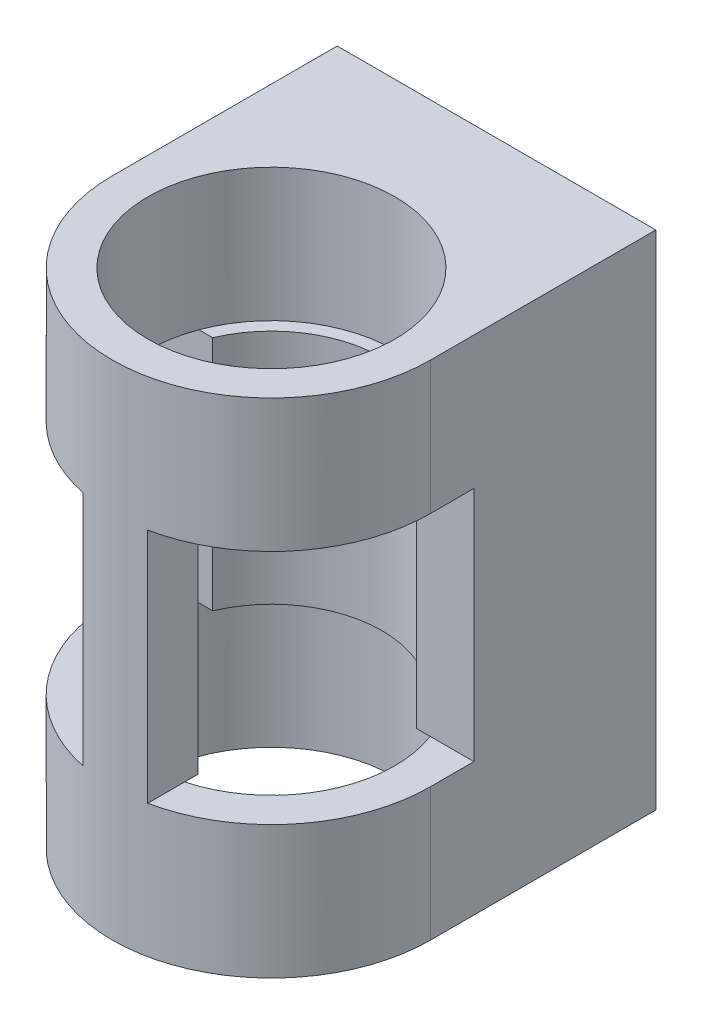
ISO-10303-21;
HEADER;
FILE_DESCRIPTION(('STEP AP214'),'2;1');
FILE_NAME('part.step','',(''),(''),'','','');
FILE_SCHEMA(('AUTOMOTIVE_DESIGN { 1 0 10303 214 1 1 1 1 }'));
ENDSEC;
DATA;
#1=APPLICATION_CONTEXT('core data for automotive mechanical design processes');
#2=APPLICATION_PROTOCOL_DEFINITION('international standard','automotive_design',2000,#1);
#3=PRODUCT_CONTEXT('',#1,'mechanical');
#4=PRODUCT('Part','Part','',(#3));
#5=PRODUCT_RELATED_PRODUCT_CATEGORY('part','',(#4));
#6=PRODUCT_DEFINITION_FORMATION('','',#4);
#7=PRODUCT_DEFINITION_CONTEXT('part definition',#1,'design');
#8=PRODUCT_DEFINITION('design','',#6,#7);
#9=PRODUCT_DEFINITION_SHAPE('','',#8);
#10=(LENGTH_UNIT() NAMED_UNIT(*) SI_UNIT(.MILLI.,.METRE.));
#11=(NAMED_UNIT(*) PLANE_ANGLE_UNIT() SI_UNIT($,.RADIAN.));
#12=(NAMED_UNIT(*) SI_UNIT($,.STERADIAN.) SOLID_ANGLE_UNIT());
#13=UNCERTAINTY_MEASURE_WITH_UNIT(LENGTH_MEASURE(1.E-05),#10,'distance_accuracy_value','');
#14=(GEOMETRIC_REPRESENTATION_CONTEXT(3) GLOBAL_UNCERTAINTY_ASSIGNED_CONTEXT((#13)) GLOBAL_UNIT_ASSIGNED_CONTEXT((#10,
#11,#12)) REPRESENTATION_CONTEXT('',''));
#15=CARTESIAN_POINT('',(0.,0.,0.));
#16=DIRECTION('',(0.,0.,1.));
#17=DIRECTION('',(1.,0.,0.));
#18=AXIS2_PLACEMENT_3D('',#15,#16,#17);
#19=CARTESIAN_POINT('',(0.,42.,0.));
#20=DIRECTION('',(0.,-1.,0.));
#21=DIRECTION('',(0.,0.,-1.));
#22=AXIS2_PLACEMENT_3D('',#19,#20,#21);
#23=CYLINDRICAL_SURFACE('',#22,9.25);
#24=DIRECTION('',(0.,-1.,0.));
#25=VECTOR('',#24,1.);
#26=CARTESIAN_POINT('',(-2.70207371651628,42.,8.84654156326142));
#27=LINE('',#26,#25);
#28=CARTESIAN_POINT('',(-2.70207371651628,30.8875,8.84654156326143));
#29=VERTEX_POINT('',#28);
#30=CARTESIAN_POINT('',(-2.70207371651628,11.1125,8.84654156326143));
#31=VERTEX_POINT('',#30);
#32=EDGE_CURVE('E430',#29,#31,#27,.T.);
#33=ORIENTED_EDGE('',*,*,#32,.F.);
#34=CARTESIAN_POINT('',(0.,30.8875,0.));
#35=DIRECTION('',(0.,1.,0.));
#36=DIRECTION('',(0.,0.,1.));
#37=AXIS2_PLACEMENT_3D('',#34,#35,#36);
#38=CIRCLE('',#37,9.25);
#39=CARTESIAN_POINT('',(2.70207371651628,30.8875,8.84654156326143));
#40=VERTEX_POINT('',#39);
#41=EDGE_CURVE('E259',#29,#40,#38,.T.);
#42=ORIENTED_EDGE('',*,*,#41,.T.);
#43=DIRECTION('',(0.,-1.,0.));
#44=VECTOR('',#43,1.);
#45=CARTESIAN_POINT('',(2.70207371651628,42.,8.84654156326142));
#46=LINE('',#45,#44);
#47=CARTESIAN_POINT('',(2.70207371651628,11.1125,8.84654156326143));
#48=VERTEX_POINT('',#47);
#49=EDGE_CURVE('E425',#48,#40,#46,.F.);
#50=ORIENTED_EDGE('',*,*,#49,.F.);
#51=CARTESIAN_POINT('',(0.,11.1125,0.));
#52=DIRECTION('',(0.,-1.,0.));
#53=DIRECTION('',(0.,0.,-1.));
#54=AXIS2_PLACEMENT_3D('',#51,#52,#53);
#55=CIRCLE('',#54,9.25);
#56=EDGE_CURVE('E249',#48,#31,#55,.T.);
#57=ORIENTED_EDGE('',*,*,#56,.T.);
#58=EDGE_LOOP('',(#33,#42,#50,#57));
#59=FACE_BOUND('',#58,.T.);
#60=ADVANCED_FACE('F37',(#59),#23,.F.);
#61=CARTESIAN_POINT('',(0.,30.8875,0.));
#62=DIRECTION('',(0.,1.,0.));
#63=DIRECTION('',(0.,0.,1.));
#64=AXIS2_PLACEMENT_3D('',#61,#62,#63);
#65=PLANE('',#64);
#66=DIRECTION('',(0.,0.,-1.));
#67=VECTOR('',#66,1.);
#68=CARTESIAN_POINT('',(-2.70207371651628,30.8875,6.20374067567504));
#69=LINE('',#68,#67);
#70=CARTESIAN_POINT('',(-2.70207371651628,30.8875,9.9586846115846));
#71=VERTEX_POINT('',#70);
#72=EDGE_CURVE('E395',#71,#29,#69,.T.);
#73=ORIENTED_EDGE('',*,*,#72,.F.);
#74=CARTESIAN_POINT('',(0.,30.8875,0.));
#75=DIRECTION('',(0.,1.,0.));
#76=DIRECTION('',(0.,0.,1.));
#77=AXIS2_PLACEMENT_3D('',#74,#75,#76);
#78=CIRCLE('',#77,10.31875);
#79=CARTESIAN_POINT('',(2.70207371651628,30.8875,9.9586846115846));
#80=VERTEX_POINT('',#79);
#81=EDGE_CURVE('E261',#71,#80,#78,.T.);
#82=ORIENTED_EDGE('',*,*,#81,.T.);
#83=DIRECTION('',(0.,0.,1.));
#84=VECTOR('',#83,1.);
#85=CARTESIAN_POINT('',(2.70207371651628,30.8875,16.0818980703134));
#86=LINE('',#85,#84);
#87=EDGE_CURVE('E402',#40,#80,#86,.T.);
#88=ORIENTED_EDGE('',*,*,#87,.F.);
#89=ORIENTED_EDGE('',*,*,#41,.F.);
#90=EDGE_LOOP('',(#73,#82,#88,#89));
#91=FACE_BOUND('',#90,.T.);
#92=ADVANCED_FACE('F479',(#91),#65,.T.);
#93=CARTESIAN_POINT('',(0.,11.1125,0.));
#94=DIRECTION('',(0.,-1.,0.));
#95=DIRECTION('',(0.,0.,-1.));
#96=AXIS2_PLACEMENT_3D('',#93,#94,#95);
#97=PLANE('',#96);
#98=DIRECTION('',(0.,0.,1.));
#99=VECTOR('',#98,1.);
#100=CARTESIAN_POINT('',(-2.70207371651628,11.1125,0.));
#101=LINE('',#100,#99);
#102=CARTESIAN_POINT('',(-2.70207371651628,11.1125,9.95738941091047));
#103=VERTEX_POINT('',#102);
#104=EDGE_CURVE('E302',#31,#103,#101,.T.);
#105=ORIENTED_EDGE('',*,*,#104,.F.);
#106=ORIENTED_EDGE('',*,*,#56,.F.);
#107=DIRECTION('',(0.,0.,-1.));
#108=VECTOR('',#107,1.);
#109=CARTESIAN_POINT('',(2.70207371651628,11.1125,0.));
#110=LINE('',#109,#108);
#111=CARTESIAN_POINT('',(2.70207371651628,11.1125,9.95738941091047));
#112=VERTEX_POINT('',#111);
#113=EDGE_CURVE('E300',#112,#48,#110,.T.);
#114=ORIENTED_EDGE('',*,*,#113,.F.);
#115=CARTESIAN_POINT('',(0.,11.1125,0.));
#116=DIRECTION('',(0.,-1.,0.));
#117=DIRECTION('',(0.,0.,-1.));
#118=AXIS2_PLACEMENT_3D('',#115,#116,#117);
#119=CIRCLE('',#118,10.3175);
#120=EDGE_CURVE('E247',#112,#103,#119,.T.);
#121=ORIENTED_EDGE('',*,*,#120,.T.);
#122=EDGE_LOOP('',(#105,#106,#114,#121));
#123=FACE_BOUND('',#122,.T.);
#124=ADVANCED_FACE('F500',(#123),#97,.T.);
#125=DIRECTION('',(0.,-1.,0.));
#126=VECTOR('',#125,1.);
#127=CARTESIAN_POINT('',(8.51779248714941,42.,-3.60689771768773));
#128=LINE('',#127,#126);
#129=CARTESIAN_POINT('',(8.51779248714941,30.8875,-3.60689771768773));
#130=VERTEX_POINT('',#129);
#131=CARTESIAN_POINT('',(8.51779248714941,11.1125,-3.60689771768773));
#132=VERTEX_POINT('',#131);
#133=EDGE_CURVE('E214',#130,#132,#128,.T.);
#134=ORIENTED_EDGE('',*,*,#133,.F.);
#135=CARTESIAN_POINT('',(-8.51779248714941,30.8875,-3.60689771768773));
#136=VERTEX_POINT('',#135);
#137=EDGE_CURVE('E279',#130,#136,#38,.T.);
#138=ORIENTED_EDGE('',*,*,#137,.T.);
#139=DIRECTION('',(0.,-1.,0.));
#140=VECTOR('',#139,1.);
#141=CARTESIAN_POINT('',(-8.51779248714941,42.,-3.60689771768773));
#142=LINE('',#141,#140);
#143=CARTESIAN_POINT('',(-8.51779248714941,11.1125,-3.60689771768773));
#144=VERTEX_POINT('',#143);
#145=EDGE_CURVE('E419',#144,#136,#142,.F.);
#146=ORIENTED_EDGE('',*,*,#145,.F.);
#147=EDGE_CURVE('E248',#144,#132,#55,.T.);
#148=ORIENTED_EDGE('',*,*,#147,.T.);
#149=EDGE_LOOP('',(#134,#138,#146,#148));
#150=FACE_BOUND('',#149,.T.);
#151=ADVANCED_FACE('F496',(#150),#23,.F.);
#152=CARTESIAN_POINT('',(0.,42.,0.));
#153=DIRECTION('',(0.,1.,0.));
#154=DIRECTION('',(0.,0.,1.));
#155=AXIS2_PLACEMENT_3D('',#152,#153,#154);
#156=PLANE('',#155);
#157=CARTESIAN_POINT('',(0.,42.,0.));
#158=DIRECTION('',(0.,1.,0.));
#159=DIRECTION('',(0.,0.,1.));
#160=AXIS2_PLACEMENT_3D('',#157,#158,#159);
#161=CIRCLE('',#160,10.31875);
#162=CARTESIAN_POINT('',(0.,42.,10.31875));
#163=VERTEX_POINT('',#162);
#164=EDGE_CURVE('E262',#163,#163,#161,.T.);
#165=ORIENTED_EDGE('',*,*,#164,.F.);
#166=EDGE_LOOP('',(#165));
#167=FACE_BOUND('',#166,.T.);
#168=DIRECTION('',(0.,0.,1.));
#169=VECTOR('',#168,1.);
#170=CARTESIAN_POINT('',(-13.31875,42.,-17.81875));
#171=LINE('',#170,#169);
#172=CARTESIAN_POINT('',(-13.31875,42.,-18.81875));
#173=VERTEX_POINT('',#172);
#174=CARTESIAN_POINT('',(-13.31875,42.,0.));
#175=VERTEX_POINT('',#174);
#176=EDGE_CURVE('E265',#173,#175,#171,.T.);
#177=ORIENTED_EDGE('',*,*,#176,.T.);
#178=CARTESIAN_POINT('',(0.,42.,0.));
#179=DIRECTION('',(0.,1.,0.));
#180=DIRECTION('',(0.,0.,1.));
#181=AXIS2_PLACEMENT_3D('',#178,#179,#180);
#182=CIRCLE('',#181,13.31875);
#183=CARTESIAN_POINT('',(13.31875,42.,0.));
#184=VERTEX_POINT('',#183);
#185=EDGE_CURVE('E267',#175,#184,#182,.T.);
#186=ORIENTED_EDGE('',*,*,#185,.T.);
#187=DIRECTION('',(0.,0.,-1.));
#188=VECTOR('',#187,1.);
#189=CARTESIAN_POINT('',(13.31875,42.,-13.31875));
#190=LINE('',#189,#188);
#191=CARTESIAN_POINT('',(13.31875,42.,-18.81875));
#192=VERTEX_POINT('',#191);
#193=EDGE_CURVE('E270',#184,#192,#190,.T.);
#194=ORIENTED_EDGE('',*,*,#193,.T.);
#195=DIRECTION('',(-1.,0.,0.));
#196=VECTOR('',#195,1.);
#197=CARTESIAN_POINT('',(-13.31875,42.,-18.81875));
#198=LINE('',#197,#196);
#199=EDGE_CURVE('E272',#192,#173,#198,.T.);
#200=ORIENTED_EDGE('',*,*,#199,.T.);
#201=EDGE_LOOP('',(#177,#186,#194,#200));
#202=FACE_BOUND('',#201,.T.);
#203=ADVANCED_FACE('F517',(#167,#202),#156,.T.);
#204=CARTESIAN_POINT('',(0.,0.,0.));
#205=DIRECTION('',(0.,1.,0.));
#206=DIRECTION('',(0.,0.,1.));
#207=AXIS2_PLACEMENT_3D('',#204,#205,#206);
#208=PLANE('',#207);
#209=CARTESIAN_POINT('',(0.,0.,0.));
#210=DIRECTION('',(0.,-1.,0.));
#211=DIRECTION('',(0.,0.,-1.));
#212=AXIS2_PLACEMENT_3D('',#209,#210,#211);
#213=CIRCLE('',#212,10.3175);
#214=CARTESIAN_POINT('',(0.,0.,-10.3175));
#215=VERTEX_POINT('',#214);
#216=EDGE_CURVE('E241',#215,#215,#213,.T.);
#217=ORIENTED_EDGE('',*,*,#216,.F.);
#218=EDGE_LOOP('',(#217));
#219=FACE_BOUND('',#218,.T.);
#220=DIRECTION('',(0.,0.,1.));
#221=VECTOR('',#220,1.);
#222=CARTESIAN_POINT('',(-13.31875,0.,0.));
#223=LINE('',#222,#221);
#224=CARTESIAN_POINT('',(-13.31875,0.,-18.81875));
#225=VERTEX_POINT('',#224);
#226=CARTESIAN_POINT('',(-13.31875,0.,0.));
#227=VERTEX_POINT('',#226);
#228=EDGE_CURVE('E275',#225,#227,#223,.T.);
#229=ORIENTED_EDGE('',*,*,#228,.F.);
#230=DIRECTION('',(-1.,0.,0.));
#231=VECTOR('',#230,1.);
#232=CARTESIAN_POINT('',(-13.31875,0.,-18.81875));
#233=LINE('',#232,#231);
#234=CARTESIAN_POINT('',(13.31875,0.,-18.81875));
#235=VERTEX_POINT('',#234);
#236=EDGE_CURVE('E268',#235,#225,#233,.T.);
#237=ORIENTED_EDGE('',*,*,#236,.F.);
#238=DIRECTION('',(0.,0.,-1.));
#239=VECTOR('',#238,1.);
#240=CARTESIAN_POINT('',(13.31875,0.,-18.81875));
#241=LINE('',#240,#239);
#242=CARTESIAN_POINT('',(13.31875,0.,0.));
#243=VERTEX_POINT('',#242);
#244=EDGE_CURVE('E282',#243,#235,#241,.T.);
#245=ORIENTED_EDGE('',*,*,#244,.F.);
#246=CARTESIAN_POINT('',(0.,0.,0.));
#247=DIRECTION('',(0.,1.,0.));
#248=DIRECTION('',(0.,0.,1.));
#249=AXIS2_PLACEMENT_3D('',#246,#247,#248);
#250=CIRCLE('',#249,13.31875);
#251=EDGE_CURVE('E278',#227,#243,#250,.T.);
#252=ORIENTED_EDGE('',*,*,#251,.F.);
#253=EDGE_LOOP('',(#229,#237,#245,#252));
#254=FACE_BOUND('',#253,.T.);
#255=ADVANCED_FACE('F522',(#219,#254),#208,.F.);
#256=CARTESIAN_POINT('',(-13.31875,42.,0.));
#257=DIRECTION('',(1.,0.,0.));
#258=DIRECTION('',(0.,0.,-1.));
#259=AXIS2_PLACEMENT_3D('',#256,#257,#258);
#260=PLANE('',#259);
#261=DIRECTION('',(0.,-1.,0.));
#262=VECTOR('',#261,1.);
#263=CARTESIAN_POINT('',(-13.31875,42.,0.));
#264=LINE('',#263,#262);
#265=CARTESIAN_POINT('',(-13.31875,11.1125,0.));
#266=VERTEX_POINT('',#265);
#267=EDGE_CURVE('E295',#266,#227,#264,.T.);
#268=ORIENTED_EDGE('',*,*,#267,.F.);
#269=DIRECTION('',(0.,0.,-1.));
#270=VECTOR('',#269,1.);
#271=CARTESIAN_POINT('',(-13.31875,11.1125,0.));
#272=LINE('',#271,#270);
#273=CARTESIAN_POINT('',(-13.31875,11.1125,-3.60689771768773));
#274=VERTEX_POINT('',#273);
#275=EDGE_CURVE('E437',#266,#274,#272,.T.);
#276=ORIENTED_EDGE('',*,*,#275,.T.);
#277=DIRECTION('',(0.,1.,0.));
#278=VECTOR('',#277,1.);
#279=CARTESIAN_POINT('',(-13.31875,42.,-3.60689771768773));
#280=LINE('',#279,#278);
#281=CARTESIAN_POINT('',(-13.31875,30.8875,-3.60689771768773));
#282=VERTEX_POINT('',#281);
#283=EDGE_CURVE('E416',#274,#282,#280,.T.);
#284=ORIENTED_EDGE('',*,*,#283,.T.);
#285=DIRECTION('',(0.,0.,-1.));
#286=VECTOR('',#285,1.);
#287=CARTESIAN_POINT('',(-13.31875,30.8875,0.));
#288=LINE('',#287,#286);
#289=CARTESIAN_POINT('',(-13.31875,30.8875,0.));
#290=VERTEX_POINT('',#289);
#291=EDGE_CURVE('E253',#290,#282,#288,.T.);
#292=ORIENTED_EDGE('',*,*,#291,.F.);
#293=EDGE_CURVE('E220',#175,#290,#264,.T.);
#294=ORIENTED_EDGE('',*,*,#293,.F.);
#295=ORIENTED_EDGE('',*,*,#176,.F.);
#296=DIRECTION('',(0.,-1.,0.));
#297=VECTOR('',#296,1.);
#298=CARTESIAN_POINT('',(-13.31875,42.,-18.81875));
#299=LINE('',#298,#297);
#300=EDGE_CURVE('E274',#173,#225,#299,.T.);
#301=ORIENTED_EDGE('',*,*,#300,.T.);
#302=ORIENTED_EDGE('',*,*,#228,.T.);
#303=EDGE_LOOP('',(#268,#276,#284,#292,#294,#295,#301,#302));
#304=FACE_BOUND('',#303,.T.);
#305=ADVANCED_FACE('F458',(#304),#260,.F.);
#306=CARTESIAN_POINT('',(0.,42.,0.));
#307=DIRECTION('',(0.,-1.,0.));
#308=DIRECTION('',(0.,0.,-1.));
#309=AXIS2_PLACEMENT_3D('',#306,#307,#308);
#310=CYLINDRICAL_SURFACE('',#309,13.31875);
#311=DIRECTION('',(0.,-1.,0.));
#312=VECTOR('',#311,1.);
#313=CARTESIAN_POINT('',(-2.70207371651628,42.,13.0417751549784));
#314=LINE('',#313,#312);
#315=CARTESIAN_POINT('',(-2.70207371651628,30.8875,13.0417751549784));
#316=VERTEX_POINT('',#315);
#317=CARTESIAN_POINT('',(-2.70207371651628,11.1125,13.0417751549784));
#318=VERTEX_POINT('',#317);
#319=EDGE_CURVE('E427',#316,#318,#314,.T.);
#320=ORIENTED_EDGE('',*,*,#319,.T.);
#321=CARTESIAN_POINT('',(0.,11.1125,0.));
#322=DIRECTION('',(0.,-1.,0.));
#323=DIRECTION('',(0.,0.,-1.));
#324=AXIS2_PLACEMENT_3D('',#321,#322,#323);
#325=CIRCLE('',#324,13.31875);
#326=EDGE_CURVE('E436',#318,#266,#325,.T.);
#327=ORIENTED_EDGE('',*,*,#326,.T.);
#328=ORIENTED_EDGE('',*,*,#267,.T.);
#329=ORIENTED_EDGE('',*,*,#251,.T.);
#330=DIRECTION('',(0.,-1.,0.));
#331=VECTOR('',#330,1.);
#332=CARTESIAN_POINT('',(13.31875,42.,0.));
#333=LINE('',#332,#331);
#334=CARTESIAN_POINT('',(13.31875,11.1125,0.));
#335=VERTEX_POINT('',#334);
#336=EDGE_CURVE('E291',#335,#243,#333,.T.);
#337=ORIENTED_EDGE('',*,*,#336,.F.);
#338=CARTESIAN_POINT('',(2.70207371651628,11.1125,13.0417751549784));
#339=VERTEX_POINT('',#338);
#340=EDGE_CURVE('E433',#335,#339,#325,.T.);
#341=ORIENTED_EDGE('',*,*,#340,.T.);
#342=DIRECTION('',(0.,-1.,0.));
#343=VECTOR('',#342,1.);
#344=CARTESIAN_POINT('',(2.70207371651628,42.,13.0417751549784));
#345=LINE('',#344,#343);
#346=CARTESIAN_POINT('',(2.70207371651628,30.8875,13.0417751549784));
#347=VERTEX_POINT('',#346);
#348=EDGE_CURVE('E422',#339,#347,#345,.F.);
#349=ORIENTED_EDGE('',*,*,#348,.T.);
#350=CARTESIAN_POINT('',(0.,30.8875,0.));
#351=DIRECTION('',(0.,-1.,0.));
#352=DIRECTION('',(0.,0.,-1.));
#353=AXIS2_PLACEMENT_3D('',#350,#351,#352);
#354=CIRCLE('',#353,13.31875);
#355=CARTESIAN_POINT('',(13.31875,30.8875,0.));
#356=VERTEX_POINT('',#355);
#357=EDGE_CURVE('E441',#356,#347,#354,.T.);
#358=ORIENTED_EDGE('',*,*,#357,.F.);
#359=EDGE_CURVE('E292',#184,#356,#333,.T.);
#360=ORIENTED_EDGE('',*,*,#359,.F.);
#361=ORIENTED_EDGE('',*,*,#185,.F.);
#362=ORIENTED_EDGE('',*,*,#293,.T.);
#363=EDGE_CURVE('E442',#316,#290,#354,.T.);
#364=ORIENTED_EDGE('',*,*,#363,.F.);
#365=EDGE_LOOP('',(#320,#327,#328,#329,#337,#341,#349,#358,#360,#361,#362,#364));
#366=FACE_BOUND('',#365,.T.);
#367=ADVANCED_FACE('F465',(#366),#310,.T.);
#368=CARTESIAN_POINT('',(13.31875,42.,-18.81875));
#369=DIRECTION('',(-1.,0.,0.));
#370=DIRECTION('',(0.,0.,1.));
#371=AXIS2_PLACEMENT_3D('',#368,#369,#370);
#372=PLANE('',#371);
#373=DIRECTION('',(0.,-1.,0.));
#374=VECTOR('',#373,1.);
#375=CARTESIAN_POINT('',(13.31875,42.,-3.60689771768773));
#376=LINE('',#375,#374);
#377=CARTESIAN_POINT('',(13.31875,30.8875,-3.60689771768773));
#378=VERTEX_POINT('',#377);
#379=CARTESIAN_POINT('',(13.31875,11.1125,-3.60689771768773));
#380=VERTEX_POINT('',#379);
#381=EDGE_CURVE('E231',#378,#380,#376,.T.);
#382=ORIENTED_EDGE('',*,*,#381,.T.);
#383=DIRECTION('',(0.,0.,1.));
#384=VECTOR('',#383,1.);
#385=CARTESIAN_POINT('',(13.31875,11.1125,-18.81875));
#386=LINE('',#385,#384);
#387=EDGE_CURVE('E229',#380,#335,#386,.T.);
#388=ORIENTED_EDGE('',*,*,#387,.T.);
#389=ORIENTED_EDGE('',*,*,#336,.T.);
#390=ORIENTED_EDGE('',*,*,#244,.T.);
#391=DIRECTION('',(0.,-1.,0.));
#392=VECTOR('',#391,1.);
#393=CARTESIAN_POINT('',(13.31875,42.,-18.81875));
#394=LINE('',#393,#392);
#395=EDGE_CURVE('E288',#192,#235,#394,.T.);
#396=ORIENTED_EDGE('',*,*,#395,.F.);
#397=ORIENTED_EDGE('',*,*,#193,.F.);
#398=ORIENTED_EDGE('',*,*,#359,.T.);
#399=DIRECTION('',(0.,0.,1.));
#400=VECTOR('',#399,1.);
#401=CARTESIAN_POINT('',(13.31875,30.8875,-18.81875));
#402=LINE('',#401,#400);
#403=EDGE_CURVE('E440',#378,#356,#402,.T.);
#404=ORIENTED_EDGE('',*,*,#403,.F.);
#405=EDGE_LOOP('',(#382,#388,#389,#390,#396,#397,#398,#404));
#406=FACE_BOUND('',#405,.T.);
#407=ADVANCED_FACE('F542',(#406),#372,.F.);
#408=CARTESIAN_POINT('',(-13.31875,42.,-18.81875));
#409=DIRECTION('',(0.,0.,1.));
#410=DIRECTION('',(1.,0.,0.));
#411=AXIS2_PLACEMENT_3D('',#408,#409,#410);
#412=PLANE('',#411);
#413=DIRECTION('',(1.,0.,0.));
#414=VECTOR('',#413,1.);
#415=CARTESIAN_POINT('',(9.5,31.,-18.81875));
#416=LINE('',#415,#414);
#417=CARTESIAN_POINT('',(-7.12,31.,-18.81875));
#418=VERTEX_POINT('',#417);
#419=CARTESIAN_POINT('',(7.12,31.,-18.81875));
#420=VERTEX_POINT('',#419);
#421=EDGE_CURVE('E346',#418,#420,#416,.T.);
#422=ORIENTED_EDGE('',*,*,#421,.F.);
#423=CARTESIAN_POINT('',(-7.12,28.62,-18.81875));
#424=DIRECTION('',(0.,0.,1.));
#425=DIRECTION('',(1.,0.,0.));
#426=AXIS2_PLACEMENT_3D('',#423,#424,#425);
#427=CIRCLE('',#426,2.38);
#428=CARTESIAN_POINT('',(-9.5,28.62,-18.81875));
#429=VERTEX_POINT('',#428);
#430=EDGE_CURVE('E333',#418,#429,#427,.T.);
#431=ORIENTED_EDGE('',*,*,#430,.T.);
#432=DIRECTION('',(0.,1.,0.));
#433=VECTOR('',#432,1.);
#434=CARTESIAN_POINT('',(-9.5,11.,-18.81875));
#435=LINE('',#434,#433);
#436=CARTESIAN_POINT('',(-9.5,13.38,-18.81875));
#437=VERTEX_POINT('',#436);
#438=EDGE_CURVE('E370',#437,#429,#435,.T.);
#439=ORIENTED_EDGE('',*,*,#438,.F.);
#440=CARTESIAN_POINT('',(-7.12,13.38,-18.81875));
#441=DIRECTION('',(0.,0.,1.));
#442=DIRECTION('',(1.,0.,0.));
#443=AXIS2_PLACEMENT_3D('',#440,#441,#442);
#444=CIRCLE('',#443,2.38);
#445=CARTESIAN_POINT('',(-7.12,11.,-18.81875));
#446=VERTEX_POINT('',#445);
#447=EDGE_CURVE('E11',#437,#446,#444,.T.);
#448=ORIENTED_EDGE('',*,*,#447,.T.);
#449=DIRECTION('',(-1.,0.,0.));
#450=VECTOR('',#449,1.);
#451=CARTESIAN_POINT('',(9.5,11.,-18.81875));
#452=LINE('',#451,#450);
#453=CARTESIAN_POINT('',(7.12,11.,-18.81875));
#454=VERTEX_POINT('',#453);
#455=EDGE_CURVE('E340',#454,#446,#452,.T.);
#456=ORIENTED_EDGE('',*,*,#455,.F.);
#457=CARTESIAN_POINT('',(7.12,13.38,-18.81875));
#458=DIRECTION('',(0.,0.,1.));
#459=DIRECTION('',(1.,0.,0.));
#460=AXIS2_PLACEMENT_3D('',#457,#458,#459);
#461=CIRCLE('',#460,2.38);
#462=CARTESIAN_POINT('',(9.5,13.38,-18.81875));
#463=VERTEX_POINT('',#462);
#464=EDGE_CURVE('E45',#454,#463,#461,.T.);
#465=ORIENTED_EDGE('',*,*,#464,.T.);
#466=DIRECTION('',(0.,-1.,0.));
#467=VECTOR('',#466,1.);
#468=CARTESIAN_POINT('',(9.5,11.,-18.81875));
#469=LINE('',#468,#467);
#470=CARTESIAN_POINT('',(9.5,28.62,-18.81875));
#471=VERTEX_POINT('',#470);
#472=EDGE_CURVE('E339',#471,#463,#469,.T.);
#473=ORIENTED_EDGE('',*,*,#472,.F.);
#474=CARTESIAN_POINT('',(7.12,28.62,-18.81875));
#475=DIRECTION('',(0.,0.,1.));
#476=DIRECTION('',(1.,0.,0.));
#477=AXIS2_PLACEMENT_3D('',#474,#475,#476);
#478=CIRCLE('',#477,2.38);
#479=EDGE_CURVE('E331',#471,#420,#478,.T.);
#480=ORIENTED_EDGE('',*,*,#479,.T.);
#481=EDGE_LOOP('',(#422,#431,#439,#448,#456,#465,#473,#480));
#482=FACE_BOUND('',#481,.T.);
#483=CARTESIAN_POINT('',(7.81875,36.5,-18.81875));
#484=DIRECTION('',(0.,0.,-1.));
#485=DIRECTION('',(-1.,0.,0.));
#486=AXIS2_PLACEMENT_3D('',#483,#484,#485);
#487=CIRCLE('',#486,3.);
#488=CARTESIAN_POINT('',(4.81875,36.5,-18.81875));
#489=VERTEX_POINT('',#488);
#490=EDGE_CURVE('E361',#489,#489,#487,.T.);
#491=ORIENTED_EDGE('',*,*,#490,.F.);
#492=EDGE_LOOP('',(#491));
#493=FACE_BOUND('',#492,.T.);
#494=CARTESIAN_POINT('',(-7.81875,36.5,-18.81875));
#495=DIRECTION('',(0.,0.,-1.));
#496=DIRECTION('',(-1.,0.,0.));
#497=AXIS2_PLACEMENT_3D('',#494,#495,#496);
#498=CIRCLE('',#497,3.);
#499=CARTESIAN_POINT('',(-10.81875,36.5,-18.81875));
#500=VERTEX_POINT('',#499);
#501=EDGE_CURVE('E387',#500,#500,#498,.T.);
#502=ORIENTED_EDGE('',*,*,#501,.F.);
#503=EDGE_LOOP('',(#502));
#504=FACE_BOUND('',#503,.T.);
#505=CARTESIAN_POINT('',(-7.81875,5.5,-18.81875));
#506=DIRECTION('',(0.,0.,-1.));
#507=DIRECTION('',(-1.,0.,0.));
#508=AXIS2_PLACEMENT_3D('',#505,#506,#507);
#509=CIRCLE('',#508,3.);
#510=CARTESIAN_POINT('',(-10.81875,5.5,-18.81875));
#511=VERTEX_POINT('',#510);
#512=EDGE_CURVE('E381',#511,#511,#509,.T.);
#513=ORIENTED_EDGE('',*,*,#512,.F.);
#514=EDGE_LOOP('',(#513));
#515=FACE_BOUND('',#514,.T.);
#516=CARTESIAN_POINT('',(7.81875,5.5,-18.81875));
#517=DIRECTION('',(0.,0.,-1.));
#518=DIRECTION('',(-1.,0.,0.));
#519=AXIS2_PLACEMENT_3D('',#516,#517,#518);
#520=CIRCLE('',#519,3.);
#521=CARTESIAN_POINT('',(4.81875,5.5,-18.81875));
#522=VERTEX_POINT('',#521);
#523=EDGE_CURVE('E380',#522,#522,#520,.T.);
#524=ORIENTED_EDGE('',*,*,#523,.F.);
#525=EDGE_LOOP('',(#524));
#526=FACE_BOUND('',#525,.T.);
#527=ORIENTED_EDGE('',*,*,#236,.T.);
#528=ORIENTED_EDGE('',*,*,#300,.F.);
#529=ORIENTED_EDGE('',*,*,#199,.F.);
#530=ORIENTED_EDGE('',*,*,#395,.T.);
#531=EDGE_LOOP('',(#527,#528,#529,#530));
#532=FACE_BOUND('',#531,.T.);
#533=ADVANCED_FACE('F337',(#482,#493,#504,#515,#526,#532),#412,.F.);
#534=CARTESIAN_POINT('',(0.,30.8875,0.));
#535=DIRECTION('',(0.,1.,0.));
#536=DIRECTION('',(0.,0.,1.));
#537=AXIS2_PLACEMENT_3D('',#534,#535,#536);
#538=CYLINDRICAL_SURFACE('',#537,10.31875);
#539=CARTESIAN_POINT('',(9.66782759551695,30.8875,-3.60689771768773));
#540=VERTEX_POINT('',#539);
#541=EDGE_CURVE('E257',#80,#540,#78,.T.);
#542=ORIENTED_EDGE('',*,*,#541,.F.);
#543=ORIENTED_EDGE('',*,*,#81,.F.);
#544=CARTESIAN_POINT('',(-9.66782759551695,30.8875,-3.60689771768773));
#545=VERTEX_POINT('',#544);
#546=EDGE_CURVE('E470',#545,#71,#78,.T.);
#547=ORIENTED_EDGE('',*,*,#546,.F.);
#548=EDGE_CURVE('E260',#540,#545,#78,.T.);
#549=ORIENTED_EDGE('',*,*,#548,.F.);
#550=EDGE_LOOP('',(#542,#543,#547,#549));
#551=FACE_BOUND('',#550,.T.);
#552=ORIENTED_EDGE('',*,*,#164,.T.);
#553=EDGE_LOOP('',(#552));
#554=FACE_BOUND('',#553,.T.);
#555=ADVANCED_FACE('F482',(#551,#554),#538,.F.);
#556=DIRECTION('',(-1.,0.,0.));
#557=VECTOR('',#556,1.);
#558=CARTESIAN_POINT('',(-18.9577659539073,30.8875,-3.60689771768773));
#559=LINE('',#558,#557);
#560=EDGE_CURVE('E489',#540,#130,#559,.T.);
#561=ORIENTED_EDGE('',*,*,#560,.F.);
#562=ORIENTED_EDGE('',*,*,#548,.T.);
#563=EDGE_CURVE('E401',#136,#545,#559,.T.);
#564=ORIENTED_EDGE('',*,*,#563,.F.);
#565=ORIENTED_EDGE('',*,*,#137,.F.);
#566=EDGE_LOOP('',(#561,#562,#564,#565));
#567=FACE_BOUND('',#566,.T.);
#568=ADVANCED_FACE('F492',(#567),#65,.T.);
#569=CARTESIAN_POINT('',(0.,11.1125,0.));
#570=DIRECTION('',(0.,-1.,0.));
#571=DIRECTION('',(0.,0.,-1.));
#572=AXIS2_PLACEMENT_3D('',#569,#570,#571);
#573=CYLINDRICAL_SURFACE('',#572,10.3175);
#574=CARTESIAN_POINT('',(9.66649342337432,11.1125,-3.60689771768773));
#575=VERTEX_POINT('',#574);
#576=EDGE_CURVE('E226',#575,#112,#119,.T.);
#577=ORIENTED_EDGE('',*,*,#576,.F.);
#578=CARTESIAN_POINT('',(-9.66649342337432,11.1125,-3.60689771768773));
#579=VERTEX_POINT('',#578);
#580=EDGE_CURVE('E236',#579,#575,#119,.T.);
#581=ORIENTED_EDGE('',*,*,#580,.F.);
#582=EDGE_CURVE('E240',#103,#579,#119,.T.);
#583=ORIENTED_EDGE('',*,*,#582,.F.);
#584=ORIENTED_EDGE('',*,*,#120,.F.);
#585=EDGE_LOOP('',(#577,#581,#583,#584));
#586=FACE_BOUND('',#585,.T.);
#587=ORIENTED_EDGE('',*,*,#216,.T.);
#588=EDGE_LOOP('',(#587));
#589=FACE_BOUND('',#588,.T.);
#590=ADVANCED_FACE('F244',(#586,#589),#573,.F.);
#591=DIRECTION('',(1.,0.,0.));
#592=VECTOR('',#591,1.);
#593=CARTESIAN_POINT('',(0.,11.1125,-3.60689771768773));
#594=LINE('',#593,#592);
#595=EDGE_CURVE('E219',#579,#144,#594,.T.);
#596=ORIENTED_EDGE('',*,*,#595,.F.);
#597=ORIENTED_EDGE('',*,*,#580,.T.);
#598=EDGE_CURVE('E208',#132,#575,#594,.T.);
#599=ORIENTED_EDGE('',*,*,#598,.F.);
#600=ORIENTED_EDGE('',*,*,#147,.F.);
#601=EDGE_LOOP('',(#596,#597,#599,#600));
#602=FACE_BOUND('',#601,.T.);
#603=ADVANCED_FACE('F237',(#602),#97,.T.);
#604=CARTESIAN_POINT('',(-18.9577659539073,-34.7870639702345,-3.60689771768773));
#605=DIRECTION('',(0.,0.,-1.));
#606=DIRECTION('',(-1.,0.,0.));
#607=AXIS2_PLACEMENT_3D('',#604,#605,#606);
#608=PLANE('',#607);
#609=ORIENTED_EDGE('',*,*,#133,.T.);
#610=ORIENTED_EDGE('',*,*,#598,.T.);
#611=DIRECTION('',(-1.,0.,0.));
#612=VECTOR('',#611,1.);
#613=CARTESIAN_POINT('',(-18.9577659539073,11.1125,-3.60689771768773));
#614=LINE('',#613,#612);
#615=EDGE_CURVE('E211',#380,#575,#614,.T.);
#616=ORIENTED_EDGE('',*,*,#615,.F.);
#617=ORIENTED_EDGE('',*,*,#381,.F.);
#618=EDGE_CURVE('E403',#378,#540,#559,.T.);
#619=ORIENTED_EDGE('',*,*,#618,.T.);
#620=ORIENTED_EDGE('',*,*,#560,.T.);
#621=EDGE_LOOP('',(#609,#610,#616,#617,#619,#620));
#622=FACE_BOUND('',#621,.T.);
#623=ADVANCED_FACE('F210',(#622),#608,.F.);
#624=CARTESIAN_POINT('',(2.70207371651628,-34.7870639702345,16.0818980703134));
#625=DIRECTION('',(-1.,0.,0.));
#626=DIRECTION('',(0.,0.,1.));
#627=AXIS2_PLACEMENT_3D('',#624,#625,#626);
#628=PLANE('',#627);
#629=ORIENTED_EDGE('',*,*,#49,.T.);
#630=ORIENTED_EDGE('',*,*,#87,.T.);
#631=EDGE_CURVE('E404',#80,#347,#86,.T.);
#632=ORIENTED_EDGE('',*,*,#631,.T.);
#633=ORIENTED_EDGE('',*,*,#348,.F.);
#634=DIRECTION('',(0.,0.,1.));
#635=VECTOR('',#634,1.);
#636=CARTESIAN_POINT('',(2.70207371651628,11.1125,16.0818980703134));
#637=LINE('',#636,#635);
#638=EDGE_CURVE('E410',#112,#339,#637,.T.);
#639=ORIENTED_EDGE('',*,*,#638,.F.);
#640=ORIENTED_EDGE('',*,*,#113,.T.);
#641=EDGE_LOOP('',(#629,#630,#632,#633,#639,#640));
#642=FACE_BOUND('',#641,.T.);
#643=ADVANCED_FACE('F505',(#642),#628,.F.);
#644=CARTESIAN_POINT('',(0.,11.1125,0.));
#645=DIRECTION('',(0.,-1.,0.));
#646=DIRECTION('',(0.,0.,-1.));
#647=AXIS2_PLACEMENT_3D('',#644,#645,#646);
#648=PLANE('',#647);
#649=ORIENTED_EDGE('',*,*,#387,.F.);
#650=ORIENTED_EDGE('',*,*,#615,.T.);
#651=ORIENTED_EDGE('',*,*,#576,.T.);
#652=ORIENTED_EDGE('',*,*,#638,.T.);
#653=ORIENTED_EDGE('',*,*,#340,.F.);
#654=EDGE_LOOP('',(#649,#650,#651,#652,#653));
#655=FACE_BOUND('',#654,.T.);
#656=ADVANCED_FACE('F223',(#655),#648,.F.);
#657=CARTESIAN_POINT('',(0.,30.8875,0.));
#658=DIRECTION('',(0.,-1.,0.));
#659=DIRECTION('',(0.,0.,-1.));
#660=AXIS2_PLACEMENT_3D('',#657,#658,#659);
#661=PLANE('',#660);
#662=ORIENTED_EDGE('',*,*,#357,.T.);
#663=ORIENTED_EDGE('',*,*,#631,.F.);
#664=ORIENTED_EDGE('',*,*,#541,.T.);
#665=ORIENTED_EDGE('',*,*,#618,.F.);
#666=ORIENTED_EDGE('',*,*,#403,.T.);
#667=EDGE_LOOP('',(#662,#663,#664,#665,#666));
#668=FACE_BOUND('',#667,.T.);
#669=ADVANCED_FACE('F486',(#668),#661,.T.);
#670=ORIENTED_EDGE('',*,*,#291,.T.);
#671=EDGE_CURVE('E398',#545,#282,#559,.T.);
#672=ORIENTED_EDGE('',*,*,#671,.F.);
#673=ORIENTED_EDGE('',*,*,#546,.T.);
#674=EDGE_CURVE('E407',#316,#71,#69,.T.);
#675=ORIENTED_EDGE('',*,*,#674,.F.);
#676=ORIENTED_EDGE('',*,*,#363,.T.);
#677=EDGE_LOOP('',(#670,#672,#673,#675,#676));
#678=FACE_BOUND('',#677,.T.);
#679=ADVANCED_FACE('F449',(#678),#661,.T.);
#680=ORIENTED_EDGE('',*,*,#326,.F.);
#681=DIRECTION('',(0.,0.,-1.));
#682=VECTOR('',#681,1.);
#683=CARTESIAN_POINT('',(-2.70207371651628,11.1125,6.20374067567504));
#684=LINE('',#683,#682);
#685=EDGE_CURVE('E412',#318,#103,#684,.T.);
#686=ORIENTED_EDGE('',*,*,#685,.T.);
#687=ORIENTED_EDGE('',*,*,#582,.T.);
#688=EDGE_CURVE('E232',#579,#274,#614,.T.);
#689=ORIENTED_EDGE('',*,*,#688,.T.);
#690=ORIENTED_EDGE('',*,*,#275,.F.);
#691=EDGE_LOOP('',(#680,#686,#687,#689,#690));
#692=FACE_BOUND('',#691,.T.);
#693=ADVANCED_FACE('F462',(#692),#648,.F.);
#694=CARTESIAN_POINT('',(-2.70207371651628,-34.7870639702345,6.20374067567504));
#695=DIRECTION('',(1.,0.,0.));
#696=DIRECTION('',(0.,0.,-1.));
#697=AXIS2_PLACEMENT_3D('',#694,#695,#696);
#698=PLANE('',#697);
#699=ORIENTED_EDGE('',*,*,#32,.T.);
#700=ORIENTED_EDGE('',*,*,#104,.T.);
#701=ORIENTED_EDGE('',*,*,#685,.F.);
#702=ORIENTED_EDGE('',*,*,#319,.F.);
#703=ORIENTED_EDGE('',*,*,#674,.T.);
#704=ORIENTED_EDGE('',*,*,#72,.T.);
#705=EDGE_LOOP('',(#699,#700,#701,#702,#703,#704));
#706=FACE_BOUND('',#705,.T.);
#707=ADVANCED_FACE('F468',(#706),#698,.F.);
#708=ORIENTED_EDGE('',*,*,#145,.T.);
#709=ORIENTED_EDGE('',*,*,#563,.T.);
#710=ORIENTED_EDGE('',*,*,#671,.T.);
#711=ORIENTED_EDGE('',*,*,#283,.F.);
#712=ORIENTED_EDGE('',*,*,#688,.F.);
#713=ORIENTED_EDGE('',*,*,#595,.T.);
#714=EDGE_LOOP('',(#708,#709,#710,#711,#712,#713));
#715=FACE_BOUND('',#714,.T.);
#716=ADVANCED_FACE('F454',(#715),#608,.F.);
#717=CARTESIAN_POINT('',(7.81875,5.5,-10.81875));
#718=DIRECTION('',(0.,0.,-1.));
#719=DIRECTION('',(-1.,0.,0.));
#720=AXIS2_PLACEMENT_3D('',#717,#718,#719);
#721=CYLINDRICAL_SURFACE('',#720,3.);
#722=CARTESIAN_POINT('',(7.81875,5.5,-10.81875));
#723=DIRECTION('',(0.,0.,-1.));
#724=DIRECTION('',(-1.,0.,0.));
#725=AXIS2_PLACEMENT_3D('',#722,#723,#724);
#726=CIRCLE('',#725,3.);
#727=CARTESIAN_POINT('',(4.81875,5.5,-10.81875));
#728=VERTEX_POINT('',#727);
#729=EDGE_CURVE('E392',#728,#728,#726,.T.);
#730=ORIENTED_EDGE('',*,*,#729,.F.);
#731=EDGE_LOOP('',(#730));
#732=FACE_BOUND('',#731,.T.);
#733=ORIENTED_EDGE('',*,*,#523,.T.);
#734=EDGE_LOOP('',(#733));
#735=FACE_BOUND('',#734,.T.);
#736=ADVANCED_FACE('F622',(#732,#735),#721,.F.);
#737=CARTESIAN_POINT('',(7.81875,5.5,-10.81875));
#738=DIRECTION('',(0.,0.,-1.));
#739=DIRECTION('',(-1.,0.,0.));
#740=AXIS2_PLACEMENT_3D('',#737,#738,#739);
#741=PLANE('',#740);
#742=ORIENTED_EDGE('',*,*,#729,.T.);
#743=EDGE_LOOP('',(#742));
#744=FACE_BOUND('',#743,.T.);
#745=ADVANCED_FACE('F604',(#744),#741,.T.);
#746=CARTESIAN_POINT('',(-7.81875,5.5,-10.81875));
#747=DIRECTION('',(0.,0.,-1.));
#748=DIRECTION('',(-1.,0.,0.));
#749=AXIS2_PLACEMENT_3D('',#746,#747,#748);
#750=CYLINDRICAL_SURFACE('',#749,3.);
#751=CARTESIAN_POINT('',(-7.81875,5.5,-10.81875));
#752=DIRECTION('',(0.,0.,-1.));
#753=DIRECTION('',(-1.,0.,0.));
#754=AXIS2_PLACEMENT_3D('',#751,#752,#753);
#755=CIRCLE('',#754,3.);
#756=CARTESIAN_POINT('',(-10.81875,5.5,-10.81875));
#757=VERTEX_POINT('',#756);
#758=EDGE_CURVE('E377',#757,#757,#755,.T.);
#759=ORIENTED_EDGE('',*,*,#758,.F.);
#760=EDGE_LOOP('',(#759));
#761=FACE_BOUND('',#760,.T.);
#762=ORIENTED_EDGE('',*,*,#512,.T.);
#763=EDGE_LOOP('',(#762));
#764=FACE_BOUND('',#763,.T.);
#765=ADVANCED_FACE('F600',(#761,#764),#750,.F.);
#766=CARTESIAN_POINT('',(-7.81875,5.5,-10.81875));
#767=DIRECTION('',(0.,0.,-1.));
#768=DIRECTION('',(-1.,0.,0.));
#769=AXIS2_PLACEMENT_3D('',#766,#767,#768);
#770=PLANE('',#769);
#771=ORIENTED_EDGE('',*,*,#758,.T.);
#772=EDGE_LOOP('',(#771));
#773=FACE_BOUND('',#772,.T.);
#774=ADVANCED_FACE('F596',(#773),#770,.T.);
#775=CARTESIAN_POINT('',(-7.81875,36.5,-10.81875));
#776=DIRECTION('',(0.,0.,-1.));
#777=DIRECTION('',(-1.,0.,0.));
#778=AXIS2_PLACEMENT_3D('',#775,#776,#777);
#779=CYLINDRICAL_SURFACE('',#778,3.);
#780=CARTESIAN_POINT('',(-7.81875,36.5,-10.81875));
#781=DIRECTION('',(0.,0.,-1.));
#782=DIRECTION('',(-1.,0.,0.));
#783=AXIS2_PLACEMENT_3D('',#780,#781,#782);
#784=CIRCLE('',#783,3.);
#785=CARTESIAN_POINT('',(-10.81875,36.5,-10.81875));
#786=VERTEX_POINT('',#785);
#787=EDGE_CURVE('E384',#786,#786,#784,.T.);
#788=ORIENTED_EDGE('',*,*,#787,.F.);
#789=EDGE_LOOP('',(#788));
#790=FACE_BOUND('',#789,.T.);
#791=ORIENTED_EDGE('',*,*,#501,.T.);
#792=EDGE_LOOP('',(#791));
#793=FACE_BOUND('',#792,.T.);
#794=ADVANCED_FACE('F599',(#790,#793),#779,.F.);
#795=CARTESIAN_POINT('',(-7.81875,36.5,-10.81875));
#796=DIRECTION('',(0.,0.,-1.));
#797=DIRECTION('',(-1.,0.,0.));
#798=AXIS2_PLACEMENT_3D('',#795,#796,#797);
#799=PLANE('',#798);
#800=ORIENTED_EDGE('',*,*,#787,.T.);
#801=EDGE_LOOP('',(#800));
#802=FACE_BOUND('',#801,.T.);
#803=ADVANCED_FACE('F606',(#802),#799,.T.);
#804=CARTESIAN_POINT('',(7.81875,36.5,-10.81875));
#805=DIRECTION('',(0.,0.,-1.));
#806=DIRECTION('',(-1.,0.,0.));
#807=AXIS2_PLACEMENT_3D('',#804,#805,#806);
#808=CYLINDRICAL_SURFACE('',#807,3.);
#809=CARTESIAN_POINT('',(7.81875,36.5,-10.81875));
#810=DIRECTION('',(0.,0.,-1.));
#811=DIRECTION('',(-1.,0.,0.));
#812=AXIS2_PLACEMENT_3D('',#809,#810,#811);
#813=CIRCLE('',#812,3.);
#814=CARTESIAN_POINT('',(4.81875,36.5,-10.81875));
#815=VERTEX_POINT('',#814);
#816=EDGE_CURVE('E364',#815,#815,#813,.T.);
#817=ORIENTED_EDGE('',*,*,#816,.F.);
#818=EDGE_LOOP('',(#817));
#819=FACE_BOUND('',#818,.T.);
#820=ORIENTED_EDGE('',*,*,#490,.T.);
#821=EDGE_LOOP('',(#820));
#822=FACE_BOUND('',#821,.T.);
#823=ADVANCED_FACE('F609',(#819,#822),#808,.F.);
#824=CARTESIAN_POINT('',(7.81875,36.5,-10.81875));
#825=DIRECTION('',(0.,0.,-1.));
#826=DIRECTION('',(-1.,0.,0.));
#827=AXIS2_PLACEMENT_3D('',#824,#825,#826);
#828=PLANE('',#827);
#829=ORIENTED_EDGE('',*,*,#816,.T.);
#830=EDGE_LOOP('',(#829));
#831=FACE_BOUND('',#830,.T.);
#832=ADVANCED_FACE('F595',(#831),#828,.T.);
#833=CARTESIAN_POINT('',(-9.5,11.,-12.81875));
#834=DIRECTION('',(-1.,0.,0.));
#835=DIRECTION('',(0.,0.,1.));
#836=AXIS2_PLACEMENT_3D('',#833,#834,#835);
#837=PLANE('',#836);
#838=ORIENTED_EDGE('',*,*,#438,.T.);
#839=DIRECTION('',(0.,0.,-1.));
#840=VECTOR('',#839,1.);
#841=CARTESIAN_POINT('',(-9.5,28.62,-12.81875));
#842=LINE('',#841,#840);
#843=CARTESIAN_POINT('',(-9.5,28.62,-12.81875));
#844=VERTEX_POINT('',#843);
#845=EDGE_CURVE('E325',#429,#844,#842,.F.);
#846=ORIENTED_EDGE('',*,*,#845,.T.);
#847=DIRECTION('',(0.,1.,0.));
#848=VECTOR('',#847,1.);
#849=CARTESIAN_POINT('',(-9.5,11.,-12.81875));
#850=LINE('',#849,#848);
#851=CARTESIAN_POINT('',(-9.5,13.38,-12.81875));
#852=VERTEX_POINT('',#851);
#853=EDGE_CURVE('E376',#852,#844,#850,.T.);
#854=ORIENTED_EDGE('',*,*,#853,.F.);
#855=DIRECTION('',(0.,0.,-1.));
#856=VECTOR('',#855,1.);
#857=CARTESIAN_POINT('',(-9.5,13.38,-18.81875));
#858=LINE('',#857,#856);
#859=EDGE_CURVE('E322',#852,#437,#858,.T.);
#860=ORIENTED_EDGE('',*,*,#859,.T.);
#861=EDGE_LOOP('',(#838,#846,#854,#860));
#862=FACE_BOUND('',#861,.T.);
#863=ADVANCED_FACE('F574',(#862),#837,.F.);
#864=CARTESIAN_POINT('',(9.5,11.,-12.81875));
#865=DIRECTION('',(0.,-1.,0.));
#866=DIRECTION('',(0.,0.,-1.));
#867=AXIS2_PLACEMENT_3D('',#864,#865,#866);
#868=PLANE('',#867);
#869=DIRECTION('',(-1.,0.,0.));
#870=VECTOR('',#869,1.);
#871=CARTESIAN_POINT('',(9.5,11.,-12.81875));
#872=LINE('',#871,#870);
#873=CARTESIAN_POINT('',(7.12,11.,-12.81875));
#874=VERTEX_POINT('',#873);
#875=CARTESIAN_POINT('',(-7.12,11.,-12.81875));
#876=VERTEX_POINT('',#875);
#877=EDGE_CURVE('E355',#874,#876,#872,.T.);
#878=ORIENTED_EDGE('',*,*,#877,.F.);
#879=DIRECTION('',(0.,0.,-1.));
#880=VECTOR('',#879,1.);
#881=CARTESIAN_POINT('',(7.12,11.,-18.81875));
#882=LINE('',#881,#880);
#883=EDGE_CURVE('E329',#874,#454,#882,.T.);
#884=ORIENTED_EDGE('',*,*,#883,.T.);
#885=ORIENTED_EDGE('',*,*,#455,.T.);
#886=DIRECTION('',(0.,0.,-1.));
#887=VECTOR('',#886,1.);
#888=CARTESIAN_POINT('',(-7.12,11.,-12.81875));
#889=LINE('',#888,#887);
#890=EDGE_CURVE('E327',#446,#876,#889,.F.);
#891=ORIENTED_EDGE('',*,*,#890,.T.);
#892=EDGE_LOOP('',(#878,#884,#885,#891));
#893=FACE_BOUND('',#892,.T.);
#894=ADVANCED_FACE('F359',(#893),#868,.F.);
#895=CARTESIAN_POINT('',(9.5,11.,-12.81875));
#896=DIRECTION('',(1.,0.,0.));
#897=DIRECTION('',(0.,0.,-1.));
#898=AXIS2_PLACEMENT_3D('',#895,#896,#897);
#899=PLANE('',#898);
#900=DIRECTION('',(0.,-1.,0.));
#901=VECTOR('',#900,1.);
#902=CARTESIAN_POINT('',(9.5,11.,-12.81875));
#903=LINE('',#902,#901);
#904=CARTESIAN_POINT('',(9.5,28.62,-12.81875));
#905=VERTEX_POINT('',#904);
#906=CARTESIAN_POINT('',(9.5,13.38,-12.81875));
#907=VERTEX_POINT('',#906);
#908=EDGE_CURVE('E357',#905,#907,#903,.T.);
#909=ORIENTED_EDGE('',*,*,#908,.F.);
#910=DIRECTION('',(0.,0.,-1.));
#911=VECTOR('',#910,1.);
#912=CARTESIAN_POINT('',(9.5,28.62,-18.81875));
#913=LINE('',#912,#911);
#914=EDGE_CURVE('E306',#905,#471,#913,.T.);
#915=ORIENTED_EDGE('',*,*,#914,.T.);
#916=ORIENTED_EDGE('',*,*,#472,.T.);
#917=DIRECTION('',(0.,0.,-1.));
#918=VECTOR('',#917,1.);
#919=CARTESIAN_POINT('',(9.5,13.38,-12.81875));
#920=LINE('',#919,#918);
#921=EDGE_CURVE('E304',#463,#907,#920,.F.);
#922=ORIENTED_EDGE('',*,*,#921,.T.);
#923=EDGE_LOOP('',(#909,#915,#916,#922));
#924=FACE_BOUND('',#923,.T.);
#925=ADVANCED_FACE('F343',(#924),#899,.F.);
#926=CARTESIAN_POINT('',(9.5,31.,-12.81875));
#927=DIRECTION('',(0.,1.,0.));
#928=DIRECTION('',(0.,0.,1.));
#929=AXIS2_PLACEMENT_3D('',#926,#927,#928);
#930=PLANE('',#929);
#931=ORIENTED_EDGE('',*,*,#421,.T.);
#932=DIRECTION('',(0.,0.,-1.));
#933=VECTOR('',#932,1.);
#934=CARTESIAN_POINT('',(7.12,31.,-12.81875));
#935=LINE('',#934,#933);
#936=CARTESIAN_POINT('',(7.12,31.,-12.81875));
#937=VERTEX_POINT('',#936);
#938=EDGE_CURVE('E312',#420,#937,#935,.F.);
#939=ORIENTED_EDGE('',*,*,#938,.T.);
#940=DIRECTION('',(1.,0.,0.));
#941=VECTOR('',#940,1.);
#942=CARTESIAN_POINT('',(9.5,31.,-12.81875));
#943=LINE('',#942,#941);
#944=CARTESIAN_POINT('',(-7.12,31.,-12.81875));
#945=VERTEX_POINT('',#944);
#946=EDGE_CURVE('E366',#945,#937,#943,.T.);
#947=ORIENTED_EDGE('',*,*,#946,.F.);
#948=DIRECTION('',(0.,0.,-1.));
#949=VECTOR('',#948,1.);
#950=CARTESIAN_POINT('',(-7.12,31.,-18.81875));
#951=LINE('',#950,#949);
#952=EDGE_CURVE('E309',#945,#418,#951,.T.);
#953=ORIENTED_EDGE('',*,*,#952,.T.);
#954=EDGE_LOOP('',(#931,#939,#947,#953));
#955=FACE_BOUND('',#954,.T.);
#956=ADVANCED_FACE('F582',(#955),#930,.F.);
#957=CARTESIAN_POINT('',(0.,0.,-12.81875));
#958=DIRECTION('',(0.,0.,1.));
#959=DIRECTION('',(1.,0.,0.));
#960=AXIS2_PLACEMENT_3D('',#957,#958,#959);
#961=PLANE('',#960);
#962=ORIENTED_EDGE('',*,*,#946,.T.);
#963=CARTESIAN_POINT('',(7.12,28.62,-12.81875));
#964=DIRECTION('',(0.,0.,1.));
#965=DIRECTION('',(1.,0.,0.));
#966=AXIS2_PLACEMENT_3D('',#963,#964,#965);
#967=CIRCLE('',#966,2.38);
#968=EDGE_CURVE('E320',#937,#905,#967,.F.);
#969=ORIENTED_EDGE('',*,*,#968,.T.);
#970=ORIENTED_EDGE('',*,*,#908,.T.);
#971=CARTESIAN_POINT('',(7.12,13.38,-12.81875));
#972=DIRECTION('',(0.,0.,1.));
#973=DIRECTION('',(1.,0.,0.));
#974=AXIS2_PLACEMENT_3D('',#971,#972,#973);
#975=CIRCLE('',#974,2.38);
#976=EDGE_CURVE('E316',#907,#874,#975,.F.);
#977=ORIENTED_EDGE('',*,*,#976,.T.);
#978=ORIENTED_EDGE('',*,*,#877,.T.);
#979=CARTESIAN_POINT('',(-7.12,13.38,-12.81875));
#980=DIRECTION('',(0.,0.,1.));
#981=DIRECTION('',(1.,0.,0.));
#982=AXIS2_PLACEMENT_3D('',#979,#980,#981);
#983=CIRCLE('',#982,2.38);
#984=EDGE_CURVE('E314',#876,#852,#983,.F.);
#985=ORIENTED_EDGE('',*,*,#984,.T.);
#986=ORIENTED_EDGE('',*,*,#853,.T.);
#987=CARTESIAN_POINT('',(-7.12,28.62,-12.81875));
#988=DIRECTION('',(0.,0.,1.));
#989=DIRECTION('',(1.,0.,0.));
#990=AXIS2_PLACEMENT_3D('',#987,#988,#989);
#991=CIRCLE('',#990,2.38);
#992=EDGE_CURVE('E318',#844,#945,#991,.F.);
#993=ORIENTED_EDGE('',*,*,#992,.T.);
#994=EDGE_LOOP('',(#962,#969,#970,#977,#978,#985,#986,#993));
#995=FACE_BOUND('',#994,.T.);
#996=ADVANCED_FACE('F354',(#995),#961,.F.);
#997=CARTESIAN_POINT('',(7.12,28.62,-12.81875));
#998=DIRECTION('',(0.,0.,1.));
#999=DIRECTION('',(1.,0.,0.));
#1000=AXIS2_PLACEMENT_3D('',#997,#998,#999);
#1001=CYLINDRICAL_SURFACE('',#1000,2.38);
#1002=ORIENTED_EDGE('',*,*,#968,.F.);
#1003=ORIENTED_EDGE('',*,*,#938,.F.);
#1004=ORIENTED_EDGE('',*,*,#479,.F.);
#1005=ORIENTED_EDGE('',*,*,#914,.F.);
#1006=EDGE_LOOP('',(#1002,#1003,#1004,#1005));
#1007=FACE_BOUND('',#1006,.T.);
#1008=ADVANCED_FACE('F555',(#1007),#1001,.F.);
#1009=CARTESIAN_POINT('',(-7.12,28.62,-12.81875));
#1010=DIRECTION('',(0.,0.,1.));
#1011=DIRECTION('',(1.,0.,0.));
#1012=AXIS2_PLACEMENT_3D('',#1009,#1010,#1011);
#1013=CYLINDRICAL_SURFACE('',#1012,2.38);
#1014=ORIENTED_EDGE('',*,*,#992,.F.);
#1015=ORIENTED_EDGE('',*,*,#845,.F.);
#1016=ORIENTED_EDGE('',*,*,#430,.F.);
#1017=ORIENTED_EDGE('',*,*,#952,.F.);
#1018=EDGE_LOOP('',(#1014,#1015,#1016,#1017));
#1019=FACE_BOUND('',#1018,.T.);
#1020=ADVANCED_FACE('F558',(#1019),#1013,.F.);
#1021=CARTESIAN_POINT('',(7.12,13.38,-12.81875));
#1022=DIRECTION('',(0.,0.,1.));
#1023=DIRECTION('',(1.,0.,0.));
#1024=AXIS2_PLACEMENT_3D('',#1021,#1022,#1023);
#1025=CYLINDRICAL_SURFACE('',#1024,2.38);
#1026=ORIENTED_EDGE('',*,*,#976,.F.);
#1027=ORIENTED_EDGE('',*,*,#921,.F.);
#1028=ORIENTED_EDGE('',*,*,#464,.F.);
#1029=ORIENTED_EDGE('',*,*,#883,.F.);
#1030=EDGE_LOOP('',(#1026,#1027,#1028,#1029));
#1031=FACE_BOUND('',#1030,.T.);
#1032=ADVANCED_FACE('F349',(#1031),#1025,.F.);
#1033=CARTESIAN_POINT('',(-7.12,13.38,-12.81875));
#1034=DIRECTION('',(0.,0.,1.));
#1035=DIRECTION('',(1.,0.,0.));
#1036=AXIS2_PLACEMENT_3D('',#1033,#1034,#1035);
#1037=CYLINDRICAL_SURFACE('',#1036,2.38);
#1038=ORIENTED_EDGE('',*,*,#984,.F.);
#1039=ORIENTED_EDGE('',*,*,#890,.F.);
#1040=ORIENTED_EDGE('',*,*,#447,.F.);
#1041=ORIENTED_EDGE('',*,*,#859,.F.);
#1042=EDGE_LOOP('',(#1038,#1039,#1040,#1041));
#1043=FACE_BOUND('',#1042,.T.);
#1044=ADVANCED_FACE('F39',(#1043),#1037,.F.);
#1045=CLOSED_SHELL('',(#60,#92,#124,#151,#203,#255,#305,#367,#407,#533,#555,#568,#590,#603,#623,
#643,#656,#669,#679,#693,#707,#716,#736,#745,#765,#774,#794,#803,#823,#832,#863,#894,#925,#956,
#996,#1008,#1020,#1032,#1044));
#1046=MANIFOLD_SOLID_BREP('B2',#1045);
#1047=ADVANCED_BREP_SHAPE_REPRESENTATION('',(#18,#1046),#14);
#1048=SHAPE_DEFINITION_REPRESENTATION(#9,#1047);
ENDSEC;
END-ISO-10303-21;
